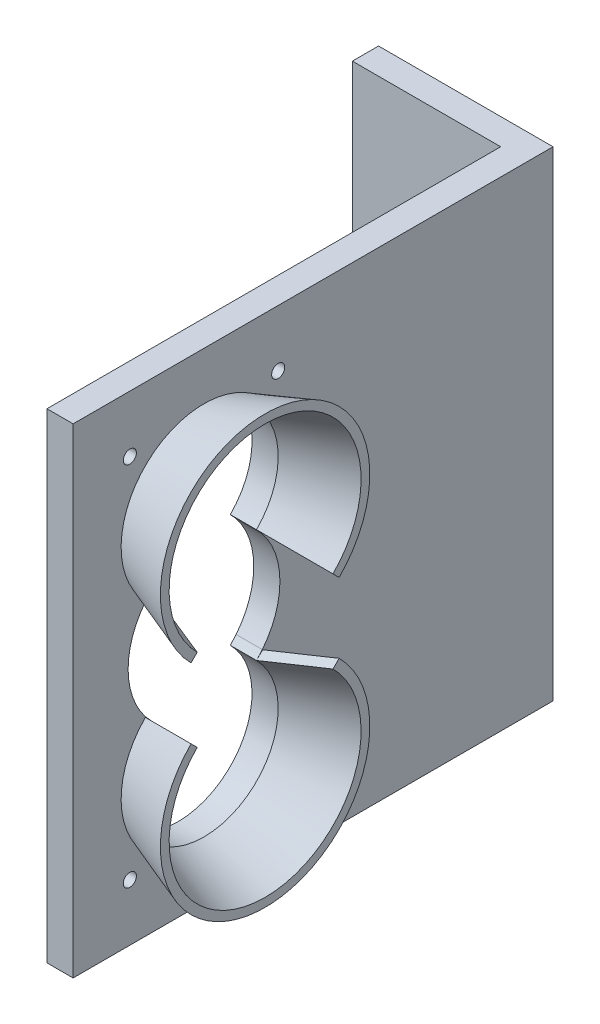
ISO-10303-21;
HEADER;
FILE_DESCRIPTION(('STEP AP214'),'2;1');
FILE_NAME('part.step','',(''),(''),'','','');
FILE_SCHEMA(('AUTOMOTIVE_DESIGN { 1 0 10303 214 1 1 1 1 }'));
ENDSEC;
DATA;
#1=APPLICATION_CONTEXT('core data for automotive mechanical design processes');
#2=APPLICATION_PROTOCOL_DEFINITION('international standard','automotive_design',2000,#1);
#3=PRODUCT_CONTEXT('',#1,'mechanical');
#4=PRODUCT('Part','Part','',(#3));
#5=PRODUCT_RELATED_PRODUCT_CATEGORY('part','',(#4));
#6=PRODUCT_DEFINITION_FORMATION('','',#4);
#7=PRODUCT_DEFINITION_CONTEXT('part definition',#1,'design');
#8=PRODUCT_DEFINITION('design','',#6,#7);
#9=PRODUCT_DEFINITION_SHAPE('','',#8);
#10=(LENGTH_UNIT() NAMED_UNIT(*) SI_UNIT(.MILLI.,.METRE.));
#11=(NAMED_UNIT(*) PLANE_ANGLE_UNIT() SI_UNIT($,.RADIAN.));
#12=(NAMED_UNIT(*) SI_UNIT($,.STERADIAN.) SOLID_ANGLE_UNIT());
#13=UNCERTAINTY_MEASURE_WITH_UNIT(LENGTH_MEASURE(1.E-05),#10,'distance_accuracy_value','');
#14=(GEOMETRIC_REPRESENTATION_CONTEXT(3) GLOBAL_UNCERTAINTY_ASSIGNED_CONTEXT((#13)) GLOBAL_UNIT_ASSIGNED_CONTEXT((#10,
#11,#12)) REPRESENTATION_CONTEXT('',''));
#15=CARTESIAN_POINT('',(0.,0.,0.));
#16=DIRECTION('',(0.,0.,1.));
#17=DIRECTION('',(1.,0.,0.));
#18=AXIS2_PLACEMENT_3D('',#15,#16,#17);
#19=CARTESIAN_POINT('',(25.8823529411765,27.5,-27.2843137254902));
#20=DIRECTION('',(-1.,0.,0.));
#21=DIRECTION('',(0.,0.,1.));
#22=AXIS2_PLACEMENT_3D('',#19,#20,#21);
#23=PLANE('',#22);
#24=CARTESIAN_POINT('',(25.8823529411765,21.,21.2156862745098));
#25=DIRECTION('',(1.,0.,0.));
#26=DIRECTION('',(0.,0.,-1.));
#27=AXIS2_PLACEMENT_3D('',#24,#25,#26);
#28=CIRCLE('',#27,0.750000000000002);
#29=CARTESIAN_POINT('',(25.8823529411765,21.,20.4656862745098));
#30=VERTEX_POINT('',#29);
#31=EDGE_CURVE('E343',#30,#30,#28,.T.);
#32=ORIENTED_EDGE('',*,*,#31,.F.);
#33=EDGE_LOOP('',(#32));
#34=FACE_BOUND('',#33,.T.);
#35=CARTESIAN_POINT('',(25.8823529411765,21.,4.2156862745098));
#36=DIRECTION('',(1.,0.,0.));
#37=DIRECTION('',(0.,0.,-1.));
#38=AXIS2_PLACEMENT_3D('',#35,#36,#37);
#39=CIRCLE('',#38,0.75);
#40=CARTESIAN_POINT('',(25.8823529411765,21.,3.4656862745098));
#41=VERTEX_POINT('',#40);
#42=EDGE_CURVE('E344',#41,#41,#39,.F.);
#43=ORIENTED_EDGE('',*,*,#42,.T.);
#44=EDGE_LOOP('',(#43));
#45=FACE_BOUND('',#44,.T.);
#46=CARTESIAN_POINT('',(25.8823529411765,-21.,21.2156862745098));
#47=DIRECTION('',(1.,0.,0.));
#48=DIRECTION('',(0.,0.,-1.));
#49=AXIS2_PLACEMENT_3D('',#46,#47,#48);
#50=CIRCLE('',#49,0.750000000000002);
#51=CARTESIAN_POINT('',(25.8823529411765,-21.,20.4656862745098));
#52=VERTEX_POINT('',#51);
#53=EDGE_CURVE('E350',#52,#52,#50,.F.);
#54=ORIENTED_EDGE('',*,*,#53,.T.);
#55=EDGE_LOOP('',(#54));
#56=FACE_BOUND('',#55,.T.);
#57=DIRECTION('',(0.,0.,-1.));
#58=VECTOR('',#57,1.);
#59=CARTESIAN_POINT('',(25.8823529411765,-27.5,-27.2843137254902));
#60=LINE('',#59,#58);
#61=CARTESIAN_POINT('',(25.8823529411765,-27.5,27.7156862745098));
#62=VERTEX_POINT('',#61);
#63=CARTESIAN_POINT('',(25.8823529411765,-27.5,-27.2843137254902));
#64=VERTEX_POINT('',#63);
#65=EDGE_CURVE('E400',#62,#64,#60,.T.);
#66=ORIENTED_EDGE('',*,*,#65,.T.);
#67=DIRECTION('',(0.,-1.,0.));
#68=VECTOR('',#67,1.);
#69=CARTESIAN_POINT('',(25.8823529411765,27.5,-27.2843137254902));
#70=LINE('',#69,#68);
#71=CARTESIAN_POINT('',(25.8823529411765,27.5,-27.2843137254902));
#72=VERTEX_POINT('',#71);
#73=EDGE_CURVE('E405',#72,#64,#70,.T.);
#74=ORIENTED_EDGE('',*,*,#73,.F.);
#75=DIRECTION('',(0.,0.,-1.));
#76=VECTOR('',#75,1.);
#77=CARTESIAN_POINT('',(25.8823529411765,27.5,-27.2843137254902));
#78=LINE('',#77,#76);
#79=CARTESIAN_POINT('',(25.8823529411765,27.5,27.7156862745098));
#80=VERTEX_POINT('',#79);
#81=EDGE_CURVE('E387',#80,#72,#78,.T.);
#82=ORIENTED_EDGE('',*,*,#81,.F.);
#83=DIRECTION('',(0.,-1.,0.));
#84=VECTOR('',#83,1.);
#85=CARTESIAN_POINT('',(25.8823529411765,27.5,27.7156862745098));
#86=LINE('',#85,#84);
#87=EDGE_CURVE('E408',#80,#62,#86,.T.);
#88=ORIENTED_EDGE('',*,*,#87,.T.);
#89=EDGE_LOOP('',(#66,#74,#82,#88));
#90=FACE_BOUND('',#89,.T.);
#91=CARTESIAN_POINT('',(25.8823529411765,-21.,4.2156862745098));
#92=DIRECTION('',(1.,0.,0.));
#93=DIRECTION('',(0.,0.,-1.));
#94=AXIS2_PLACEMENT_3D('',#91,#92,#93);
#95=CIRCLE('',#94,0.75);
#96=CARTESIAN_POINT('',(25.8823529411765,-21.,3.4656862745098));
#97=VERTEX_POINT('',#96);
#98=EDGE_CURVE('E351',#97,#97,#95,.T.);
#99=ORIENTED_EDGE('',*,*,#98,.F.);
#100=EDGE_LOOP('',(#99));
#101=FACE_BOUND('',#100,.T.);
#102=DIRECTION('',(0.,0.707106781186551,-0.707106781186544));
#103=VECTOR('',#102,1.);
#104=CARTESIAN_POINT('',(25.8823529411765,-21.3388347648319,21.5545210393416));
#105=LINE('',#104,#103);
#106=CARTESIAN_POINT('',(25.8823529411765,-6.48959235991435,6.70527863442414));
#107=VERTEX_POINT('',#106);
#108=CARTESIAN_POINT('',(25.8823529411765,-5.78248557872775,5.99817185323764));
#109=VERTEX_POINT('',#108);
#110=EDGE_CURVE('E773',#107,#109,#105,.T.);
#111=ORIENTED_EDGE('',*,*,#110,.T.);
#112=CARTESIAN_POINT('',(25.8823529411765,-12.5,12.7156862745098));
#113=DIRECTION('',(-1.,0.,0.));
#114=DIRECTION('',(0.,-1.,0.));
#115=AXIS2_PLACEMENT_3D('',#112,#113,#114);
#116=CIRCLE('',#115,9.5);
#117=CARTESIAN_POINT('',(25.8823529411765,-5.78248557872775,19.433200695782));
#118=VERTEX_POINT('',#117);
#119=EDGE_CURVE('E317',#109,#118,#116,.T.);
#120=ORIENTED_EDGE('',*,*,#119,.T.);
#121=DIRECTION('',(0.,0.707106781186551,0.707106781186544));
#122=VECTOR('',#121,1.);
#123=CARTESIAN_POINT('',(25.8823529411765,-21.3388347648319,3.87685150967802));
#124=LINE('',#123,#122);
#125=CARTESIAN_POINT('',(25.8823529411765,-6.4895923599143,18.7260939145954));
#126=VERTEX_POINT('',#125);
#127=EDGE_CURVE('E295',#126,#118,#124,.T.);
#128=ORIENTED_EDGE('',*,*,#127,.F.);
#129=DIRECTION('',(0.,-0.744628434388798,-0.667479209189086));
#130=VECTOR('',#129,1.);
#131=CARTESIAN_POINT('',(25.8823529411765,-12.1986163895243,13.6085686247462));
#132=LINE('',#131,#130);
#133=CARTESIAN_POINT('',(25.8823529411765,-5.74397055779098,19.3944635709919));
#134=VERTEX_POINT('',#133);
#135=EDGE_CURVE('E309',#134,#126,#132,.T.);
#136=ORIENTED_EDGE('',*,*,#135,.F.);
#137=CARTESIAN_POINT('',(25.8823529411765,1.196959198424E-13,12.236501554681));
#138=DIRECTION('',(1.,0.,0.));
#139=DIRECTION('',(0.,0.,-1.));
#140=AXIS2_PLACEMENT_3D('',#137,#138,#139);
#141=CIRCLE('',#140,9.17766952966388);
#142=CARTESIAN_POINT('',(25.8823529411765,5.74397055779107,19.394463570992));
#143=VERTEX_POINT('',#142);
#144=EDGE_CURVE('E820',#143,#134,#141,.T.);
#145=ORIENTED_EDGE('',*,*,#144,.F.);
#146=DIRECTION('',(0.,-0.744628434388801,0.667479209189083));
#147=VECTOR('',#146,1.);
#148=CARTESIAN_POINT('',(25.8823529411765,12.1986163895244,13.6085686247464));
#149=LINE('',#148,#147);
#150=CARTESIAN_POINT('',(25.8823529411765,6.4895923599143,18.7260939145954));
#151=VERTEX_POINT('',#150);
#152=EDGE_CURVE('E843',#151,#143,#149,.T.);
#153=ORIENTED_EDGE('',*,*,#152,.F.);
#154=DIRECTION('',(0.,-0.707106781186551,0.707106781186544));
#155=VECTOR('',#154,1.);
#156=CARTESIAN_POINT('',(25.8823529411765,21.3388347648319,3.87685150967802));
#157=LINE('',#156,#155);
#158=CARTESIAN_POINT('',(25.8823529411765,5.78248557872775,19.433200695782));
#159=VERTEX_POINT('',#158);
#160=EDGE_CURVE('E792',#151,#159,#157,.T.);
#161=ORIENTED_EDGE('',*,*,#160,.T.);
#162=CARTESIAN_POINT('',(25.8823529411765,12.5,12.7156862745098));
#163=DIRECTION('',(1.,0.,0.));
#164=DIRECTION('',(0.,1.,0.));
#165=AXIS2_PLACEMENT_3D('',#162,#163,#164);
#166=CIRCLE('',#165,9.5);
#167=CARTESIAN_POINT('',(25.8823529411765,5.78248557872775,5.99817185323764));
#168=VERTEX_POINT('',#167);
#169=EDGE_CURVE('E325',#168,#159,#166,.T.);
#170=ORIENTED_EDGE('',*,*,#169,.F.);
#171=DIRECTION('',(0.,-0.707106781186551,-0.707106781186544));
#172=VECTOR('',#171,1.);
#173=CARTESIAN_POINT('',(25.8823529411765,21.3388347648319,21.5545210393416));
#174=LINE('',#173,#172);
#175=CARTESIAN_POINT('',(25.8823529411765,6.48959235991431,6.70527863442419));
#176=VERTEX_POINT('',#175);
#177=EDGE_CURVE('E801',#176,#168,#174,.T.);
#178=ORIENTED_EDGE('',*,*,#177,.F.);
#179=DIRECTION('',(0.,-0.744628434388791,-0.667479209189094));
#180=VECTOR('',#179,1.);
#181=CARTESIAN_POINT('',(25.8823529411765,-0.441386082782293,0.492402794361899));
#182=LINE('',#181,#180);
#183=CARTESIAN_POINT('',(25.8823529411765,5.74397055779076,6.03690897802793));
#184=VERTEX_POINT('',#183);
#185=EDGE_CURVE('E837',#176,#184,#182,.T.);
#186=ORIENTED_EDGE('',*,*,#185,.T.);
#187=CARTESIAN_POINT('',(25.8823529411765,0.,13.1948709943384));
#188=DIRECTION('',(1.,0.,0.));
#189=DIRECTION('',(0.,0.,-1.));
#190=AXIS2_PLACEMENT_3D('',#187,#188,#189);
#191=CIRCLE('',#190,9.17766952966348);
#192=CARTESIAN_POINT('',(25.8823529411765,-5.74397055779096,6.03690897802773));
#193=VERTEX_POINT('',#192);
#194=EDGE_CURVE('E834',#184,#193,#191,.F.);
#195=ORIENTED_EDGE('',*,*,#194,.T.);
#196=DIRECTION('',(0.,-0.744628434388816,0.667479209189066));
#197=VECTOR('',#196,1.);
#198=CARTESIAN_POINT('',(25.8823529411765,0.441386082782288,0.49240279436193));
#199=LINE('',#198,#197);
#200=EDGE_CURVE('E308',#193,#107,#199,.T.);
#201=ORIENTED_EDGE('',*,*,#200,.T.);
#202=EDGE_LOOP('',(#111,#120,#128,#136,#145,#153,#161,#170,#178,#186,#195,#201));
#203=FACE_BOUND('',#202,.T.);
#204=ADVANCED_FACE('F149',(#34,#45,#56,#90,#101,#203),#23,.F.);
#205=CARTESIAN_POINT('',(22.8823529411765,27.5,27.7156862745098));
#206=DIRECTION('',(1.,0.,0.));
#207=DIRECTION('',(0.,0.,-1.));
#208=AXIS2_PLACEMENT_3D('',#205,#206,#207);
#209=PLANE('',#208);
#210=CARTESIAN_POINT('',(22.8823529411765,21.,21.2156862745098));
#211=DIRECTION('',(1.,0.,0.));
#212=DIRECTION('',(0.,0.,-1.));
#213=AXIS2_PLACEMENT_3D('',#210,#211,#212);
#214=CIRCLE('',#213,0.750000000000002);
#215=CARTESIAN_POINT('',(22.8823529411765,21.,20.4656862745098));
#216=VERTEX_POINT('',#215);
#217=EDGE_CURVE('E354',#216,#216,#214,.T.);
#218=ORIENTED_EDGE('',*,*,#217,.T.);
#219=EDGE_LOOP('',(#218));
#220=FACE_BOUND('',#219,.T.);
#221=CARTESIAN_POINT('',(22.8823529411765,21.,4.2156862745098));
#222=DIRECTION('',(1.,0.,0.));
#223=DIRECTION('',(0.,0.,-1.));
#224=AXIS2_PLACEMENT_3D('',#221,#222,#223);
#225=CIRCLE('',#224,0.75);
#226=CARTESIAN_POINT('',(22.8823529411765,21.,3.4656862745098));
#227=VERTEX_POINT('',#226);
#228=EDGE_CURVE('E340',#227,#227,#225,.F.);
#229=ORIENTED_EDGE('',*,*,#228,.F.);
#230=EDGE_LOOP('',(#229));
#231=FACE_BOUND('',#230,.T.);
#232=CARTESIAN_POINT('',(22.8823529411765,-21.,21.2156862745098));
#233=DIRECTION('',(1.,0.,0.));
#234=DIRECTION('',(0.,0.,-1.));
#235=AXIS2_PLACEMENT_3D('',#232,#233,#234);
#236=CIRCLE('',#235,0.750000000000002);
#237=CARTESIAN_POINT('',(22.8823529411765,-21.,20.4656862745098));
#238=VERTEX_POINT('',#237);
#239=EDGE_CURVE('E359',#238,#238,#236,.F.);
#240=ORIENTED_EDGE('',*,*,#239,.F.);
#241=EDGE_LOOP('',(#240));
#242=FACE_BOUND('',#241,.T.);
#243=DIRECTION('',(0.,0.,1.));
#244=VECTOR('',#243,1.);
#245=CARTESIAN_POINT('',(22.8823529411765,-27.5,27.7156862745098));
#246=LINE('',#245,#244);
#247=CARTESIAN_POINT('',(22.8823529411765,-27.5,-24.2843137254902));
#248=VERTEX_POINT('',#247);
#249=CARTESIAN_POINT('',(22.8823529411765,-27.5,27.7156862745098));
#250=VERTEX_POINT('',#249);
#251=EDGE_CURVE('E396',#248,#250,#246,.T.);
#252=ORIENTED_EDGE('',*,*,#251,.T.);
#253=DIRECTION('',(0.,-1.,0.));
#254=VECTOR('',#253,1.);
#255=CARTESIAN_POINT('',(22.8823529411765,27.5,27.7156862745098));
#256=LINE('',#255,#254);
#257=CARTESIAN_POINT('',(22.8823529411765,27.5,27.7156862745098));
#258=VERTEX_POINT('',#257);
#259=EDGE_CURVE('E411',#258,#250,#256,.T.);
#260=ORIENTED_EDGE('',*,*,#259,.F.);
#261=DIRECTION('',(0.,0.,1.));
#262=VECTOR('',#261,1.);
#263=CARTESIAN_POINT('',(22.8823529411765,27.5,27.7156862745098));
#264=LINE('',#263,#262);
#265=CARTESIAN_POINT('',(22.8823529411765,27.5,-24.2843137254902));
#266=VERTEX_POINT('',#265);
#267=EDGE_CURVE('E383',#266,#258,#264,.T.);
#268=ORIENTED_EDGE('',*,*,#267,.F.);
#269=DIRECTION('',(0.,-1.,0.));
#270=VECTOR('',#269,1.);
#271=CARTESIAN_POINT('',(22.8823529411765,27.5,-24.2843137254902));
#272=LINE('',#271,#270);
#273=EDGE_CURVE('E157',#266,#248,#272,.T.);
#274=ORIENTED_EDGE('',*,*,#273,.T.);
#275=EDGE_LOOP('',(#252,#260,#268,#274));
#276=FACE_BOUND('',#275,.T.);
#277=CARTESIAN_POINT('',(22.8823529411765,1.196959198424E-13,12.236501554681));
#278=DIRECTION('',(1.,0.,0.));
#279=DIRECTION('',(0.,0.,-1.));
#280=AXIS2_PLACEMENT_3D('',#277,#278,#279);
#281=CIRCLE('',#280,9.17766952966388);
#282=CARTESIAN_POINT('',(22.8823529411765,5.74397055779107,19.394463570992));
#283=VERTEX_POINT('',#282);
#284=CARTESIAN_POINT('',(22.8823529411765,-5.74397055779098,19.3944635709919));
#285=VERTEX_POINT('',#284);
#286=EDGE_CURVE('E331',#283,#285,#281,.T.);
#287=ORIENTED_EDGE('',*,*,#286,.T.);
#288=DIRECTION('',(0.,-0.744628434388798,-0.667479209189086));
#289=VECTOR('',#288,1.);
#290=CARTESIAN_POINT('',(22.8823529411765,-12.1986163895243,13.6085686247462));
#291=LINE('',#290,#289);
#292=CARTESIAN_POINT('',(22.8823529411765,-6.48959235991436,18.7260939145955));
#293=VERTEX_POINT('',#292);
#294=EDGE_CURVE('E818',#285,#293,#291,.T.);
#295=ORIENTED_EDGE('',*,*,#294,.T.);
#296=CARTESIAN_POINT('',(22.8823529411765,-12.5,12.7156862745098));
#297=DIRECTION('',(1.,0.,0.));
#298=DIRECTION('',(0.,0.,-1.));
#299=AXIS2_PLACEMENT_3D('',#296,#297,#298);
#300=CIRCLE('',#299,8.5);
#301=CARTESIAN_POINT('',(22.8823529411765,-6.48959235991435,6.70527863442414));
#302=VERTEX_POINT('',#301);
#303=EDGE_CURVE('E329',#293,#302,#300,.T.);
#304=ORIENTED_EDGE('',*,*,#303,.T.);
#305=DIRECTION('',(0.,-0.744628434388816,0.667479209189066));
#306=VECTOR('',#305,1.);
#307=CARTESIAN_POINT('',(22.8823529411765,0.441386082782288,0.49240279436193));
#308=LINE('',#307,#306);
#309=CARTESIAN_POINT('',(22.8823529411765,-5.74397055779096,6.03690897802773));
#310=VERTEX_POINT('',#309);
#311=EDGE_CURVE('E822',#310,#302,#308,.T.);
#312=ORIENTED_EDGE('',*,*,#311,.F.);
#313=CARTESIAN_POINT('',(22.8823529411765,0.,13.1948709943384));
#314=DIRECTION('',(1.,0.,0.));
#315=DIRECTION('',(0.,0.,-1.));
#316=AXIS2_PLACEMENT_3D('',#313,#314,#315);
#317=CIRCLE('',#316,9.17766952966348);
#318=CARTESIAN_POINT('',(22.8823529411765,5.74397055779076,6.03690897802793));
#319=VERTEX_POINT('',#318);
#320=EDGE_CURVE('E824',#319,#310,#317,.F.);
#321=ORIENTED_EDGE('',*,*,#320,.F.);
#322=DIRECTION('',(0.,-0.744628434388791,-0.667479209189094));
#323=VECTOR('',#322,1.);
#324=CARTESIAN_POINT('',(22.8823529411765,-0.441386082782293,0.492402794361899));
#325=LINE('',#324,#323);
#326=CARTESIAN_POINT('',(22.8823529411765,6.48959235991413,6.70527863442437));
#327=VERTEX_POINT('',#326);
#328=EDGE_CURVE('E826',#327,#319,#325,.T.);
#329=ORIENTED_EDGE('',*,*,#328,.F.);
#330=CARTESIAN_POINT('',(22.8823529411765,12.5,12.7156862745098));
#331=DIRECTION('',(1.,0.,0.));
#332=DIRECTION('',(0.,0.,-1.));
#333=AXIS2_PLACEMENT_3D('',#330,#331,#332);
#334=CIRCLE('',#333,8.5);
#335=CARTESIAN_POINT('',(22.8823529411765,6.48959235991446,18.7260939145956));
#336=VERTEX_POINT('',#335);
#337=EDGE_CURVE('E828',#327,#336,#334,.T.);
#338=ORIENTED_EDGE('',*,*,#337,.T.);
#339=DIRECTION('',(0.,-0.744628434388801,0.667479209189083));
#340=VECTOR('',#339,1.);
#341=CARTESIAN_POINT('',(22.8823529411765,12.1986163895244,13.6085686247464));
#342=LINE('',#341,#340);
#343=EDGE_CURVE('E336',#336,#283,#342,.T.);
#344=ORIENTED_EDGE('',*,*,#343,.T.);
#345=EDGE_LOOP('',(#287,#295,#304,#312,#321,#329,#338,#344));
#346=FACE_BOUND('',#345,.T.);
#347=CARTESIAN_POINT('',(22.8823529411765,-21.,4.2156862745098));
#348=DIRECTION('',(1.,0.,0.));
#349=DIRECTION('',(0.,0.,-1.));
#350=AXIS2_PLACEMENT_3D('',#347,#348,#349);
#351=CIRCLE('',#350,0.75);
#352=CARTESIAN_POINT('',(22.8823529411765,-21.,3.4656862745098));
#353=VERTEX_POINT('',#352);
#354=EDGE_CURVE('E347',#353,#353,#351,.T.);
#355=ORIENTED_EDGE('',*,*,#354,.T.);
#356=EDGE_LOOP('',(#355));
#357=FACE_BOUND('',#356,.T.);
#358=ADVANCED_FACE('F418',(#220,#231,#242,#276,#346,#357),#209,.F.);
#359=CARTESIAN_POINT('',(22.8823529411765,27.5,-24.2843137254902));
#360=DIRECTION('',(0.,0.,-1.));
#361=DIRECTION('',(-1.,0.,0.));
#362=AXIS2_PLACEMENT_3D('',#359,#360,#361);
#363=PLANE('',#362);
#364=CARTESIAN_POINT('',(13.3823529411765,-10.,-24.2843137254902));
#365=DIRECTION('',(0.,0.,-1.));
#366=DIRECTION('',(-1.,0.,0.));
#367=AXIS2_PLACEMENT_3D('',#364,#365,#366);
#368=CIRCLE('',#367,1.5);
#369=CARTESIAN_POINT('',(11.8823529411765,-10.,-24.2843137254902));
#370=VERTEX_POINT('',#369);
#371=EDGE_CURVE('E372',#370,#370,#368,.T.);
#372=ORIENTED_EDGE('',*,*,#371,.T.);
#373=EDGE_LOOP('',(#372));
#374=FACE_BOUND('',#373,.T.);
#375=DIRECTION('',(1.,0.,0.));
#376=VECTOR('',#375,1.);
#377=CARTESIAN_POINT('',(22.8823529411765,-27.5,-24.2843137254902));
#378=LINE('',#377,#376);
#379=CARTESIAN_POINT('',(5.88235294117648,-27.5,-24.2843137254902));
#380=VERTEX_POINT('',#379);
#381=EDGE_CURVE('E394',#380,#248,#378,.T.);
#382=ORIENTED_EDGE('',*,*,#381,.T.);
#383=ORIENTED_EDGE('',*,*,#273,.F.);
#384=DIRECTION('',(1.,0.,0.));
#385=VECTOR('',#384,1.);
#386=CARTESIAN_POINT('',(22.8823529411765,27.5,-24.2843137254902));
#387=LINE('',#386,#385);
#388=CARTESIAN_POINT('',(5.88235294117648,27.5,-24.2843137254902));
#389=VERTEX_POINT('',#388);
#390=EDGE_CURVE('E380',#389,#266,#387,.T.);
#391=ORIENTED_EDGE('',*,*,#390,.F.);
#392=DIRECTION('',(0.,-1.,0.));
#393=VECTOR('',#392,1.);
#394=CARTESIAN_POINT('',(5.88235294117648,27.5,-24.2843137254902));
#395=LINE('',#394,#393);
#396=EDGE_CURVE('E12',#389,#380,#395,.T.);
#397=ORIENTED_EDGE('',*,*,#396,.T.);
#398=EDGE_LOOP('',(#382,#383,#391,#397));
#399=FACE_BOUND('',#398,.T.);
#400=CARTESIAN_POINT('',(13.3823529411765,10.,-24.2843137254902));
#401=DIRECTION('',(0.,0.,-1.));
#402=DIRECTION('',(-1.,0.,0.));
#403=AXIS2_PLACEMENT_3D('',#400,#401,#402);
#404=CIRCLE('',#403,1.5);
#405=CARTESIAN_POINT('',(11.8823529411765,10.,-24.2843137254902));
#406=VERTEX_POINT('',#405);
#407=EDGE_CURVE('E365',#406,#406,#404,.F.);
#408=ORIENTED_EDGE('',*,*,#407,.F.);
#409=EDGE_LOOP('',(#408));
#410=FACE_BOUND('',#409,.T.);
#411=ADVANCED_FACE('F442',(#374,#399,#410),#363,.F.);
#412=CARTESIAN_POINT('',(5.88235294117648,27.5,-27.2843137254902));
#413=DIRECTION('',(0.,0.,1.));
#414=DIRECTION('',(1.,0.,0.));
#415=AXIS2_PLACEMENT_3D('',#412,#413,#414);
#416=PLANE('',#415);
#417=CARTESIAN_POINT('',(13.3823529411765,-10.,-27.2843137254902));
#418=DIRECTION('',(0.,0.,-1.));
#419=DIRECTION('',(-1.,0.,0.));
#420=AXIS2_PLACEMENT_3D('',#417,#418,#419);
#421=CIRCLE('',#420,1.5);
#422=CARTESIAN_POINT('',(11.8823529411765,-10.,-27.2843137254902));
#423=VERTEX_POINT('',#422);
#424=EDGE_CURVE('E362',#423,#423,#421,.T.);
#425=ORIENTED_EDGE('',*,*,#424,.F.);
#426=EDGE_LOOP('',(#425));
#427=FACE_BOUND('',#426,.T.);
#428=DIRECTION('',(-1.,0.,0.));
#429=VECTOR('',#428,1.);
#430=CARTESIAN_POINT('',(5.88235294117648,-27.5,-27.2843137254902));
#431=LINE('',#430,#429);
#432=CARTESIAN_POINT('',(5.88235294117648,-27.5,-27.2843137254902));
#433=VERTEX_POINT('',#432);
#434=EDGE_CURVE('E381',#64,#433,#431,.T.);
#435=ORIENTED_EDGE('',*,*,#434,.T.);
#436=DIRECTION('',(0.,-1.,0.));
#437=VECTOR('',#436,1.);
#438=CARTESIAN_POINT('',(5.88235294117648,27.5,-27.2843137254902));
#439=LINE('',#438,#437);
#440=CARTESIAN_POINT('',(5.88235294117648,27.5,-27.2843137254902));
#441=VERTEX_POINT('',#440);
#442=EDGE_CURVE('E391',#441,#433,#439,.T.);
#443=ORIENTED_EDGE('',*,*,#442,.F.);
#444=DIRECTION('',(-1.,0.,0.));
#445=VECTOR('',#444,1.);
#446=CARTESIAN_POINT('',(5.88235294117648,27.5,-27.2843137254902));
#447=LINE('',#446,#445);
#448=EDGE_CURVE('E389',#72,#441,#447,.T.);
#449=ORIENTED_EDGE('',*,*,#448,.F.);
#450=ORIENTED_EDGE('',*,*,#73,.T.);
#451=EDGE_LOOP('',(#435,#443,#449,#450));
#452=FACE_BOUND('',#451,.T.);
#453=CARTESIAN_POINT('',(13.3823529411765,10.,-27.2843137254902));
#454=DIRECTION('',(0.,0.,-1.));
#455=DIRECTION('',(-1.,0.,0.));
#456=AXIS2_PLACEMENT_3D('',#453,#454,#455);
#457=CIRCLE('',#456,1.5);
#458=CARTESIAN_POINT('',(11.8823529411765,10.,-27.2843137254902));
#459=VERTEX_POINT('',#458);
#460=EDGE_CURVE('E369',#459,#459,#457,.F.);
#461=ORIENTED_EDGE('',*,*,#460,.T.);
#462=EDGE_LOOP('',(#461));
#463=FACE_BOUND('',#462,.T.);
#464=ADVANCED_FACE('F446',(#427,#452,#463),#416,.F.);
#465=CARTESIAN_POINT('',(5.88235294117648,27.5,-24.2843137254902));
#466=DIRECTION('',(1.,0.,0.));
#467=DIRECTION('',(0.,0.,-1.));
#468=AXIS2_PLACEMENT_3D('',#465,#466,#467);
#469=PLANE('',#468);
#470=DIRECTION('',(0.,0.,1.));
#471=VECTOR('',#470,1.);
#472=CARTESIAN_POINT('',(5.88235294117648,-27.5,-24.2843137254902));
#473=LINE('',#472,#471);
#474=EDGE_CURVE('E368',#433,#380,#473,.T.);
#475=ORIENTED_EDGE('',*,*,#474,.T.);
#476=ORIENTED_EDGE('',*,*,#396,.F.);
#477=DIRECTION('',(0.,0.,1.));
#478=VECTOR('',#477,1.);
#479=CARTESIAN_POINT('',(5.88235294117648,27.5,-24.2843137254902));
#480=LINE('',#479,#478);
#481=EDGE_CURVE('E377',#441,#389,#480,.T.);
#482=ORIENTED_EDGE('',*,*,#481,.F.);
#483=ORIENTED_EDGE('',*,*,#442,.T.);
#484=EDGE_LOOP('',(#475,#476,#482,#483));
#485=FACE_BOUND('',#484,.T.);
#486=ADVANCED_FACE('F151',(#485),#469,.F.);
#487=CARTESIAN_POINT('',(25.8823529411765,27.5,27.7156862745098));
#488=DIRECTION('',(0.,0.,-1.));
#489=DIRECTION('',(-1.,0.,0.));
#490=AXIS2_PLACEMENT_3D('',#487,#488,#489);
#491=PLANE('',#490);
#492=DIRECTION('',(1.,0.,0.));
#493=VECTOR('',#492,1.);
#494=CARTESIAN_POINT('',(25.8823529411765,-27.5,27.7156862745098));
#495=LINE('',#494,#493);
#496=EDGE_CURVE('E398',#250,#62,#495,.T.);
#497=ORIENTED_EDGE('',*,*,#496,.T.);
#498=ORIENTED_EDGE('',*,*,#87,.F.);
#499=DIRECTION('',(1.,0.,0.));
#500=VECTOR('',#499,1.);
#501=CARTESIAN_POINT('',(25.8823529411765,27.5,27.7156862745098));
#502=LINE('',#501,#500);
#503=EDGE_CURVE('E385',#258,#80,#502,.T.);
#504=ORIENTED_EDGE('',*,*,#503,.F.);
#505=ORIENTED_EDGE('',*,*,#259,.T.);
#506=EDGE_LOOP('',(#497,#498,#504,#505));
#507=FACE_BOUND('',#506,.T.);
#508=ADVANCED_FACE('F430',(#507),#491,.F.);
#509=CARTESIAN_POINT('',(0.,27.5,0.));
#510=DIRECTION('',(0.,-1.,0.));
#511=DIRECTION('',(0.,0.,-1.));
#512=AXIS2_PLACEMENT_3D('',#509,#510,#511);
#513=PLANE('',#512);
#514=ORIENTED_EDGE('',*,*,#481,.T.);
#515=ORIENTED_EDGE('',*,*,#390,.T.);
#516=ORIENTED_EDGE('',*,*,#267,.T.);
#517=ORIENTED_EDGE('',*,*,#503,.T.);
#518=ORIENTED_EDGE('',*,*,#81,.T.);
#519=ORIENTED_EDGE('',*,*,#448,.T.);
#520=EDGE_LOOP('',(#514,#515,#516,#517,#518,#519));
#521=FACE_BOUND('',#520,.T.);
#522=ADVANCED_FACE('F438',(#521),#513,.F.);
#523=CARTESIAN_POINT('',(0.,-27.5,0.));
#524=DIRECTION('',(0.,-1.,0.));
#525=DIRECTION('',(0.,0.,-1.));
#526=AXIS2_PLACEMENT_3D('',#523,#524,#525);
#527=PLANE('',#526);
#528=ORIENTED_EDGE('',*,*,#474,.F.);
#529=ORIENTED_EDGE('',*,*,#434,.F.);
#530=ORIENTED_EDGE('',*,*,#65,.F.);
#531=ORIENTED_EDGE('',*,*,#496,.F.);
#532=ORIENTED_EDGE('',*,*,#251,.F.);
#533=ORIENTED_EDGE('',*,*,#381,.F.);
#534=EDGE_LOOP('',(#528,#529,#530,#531,#532,#533));
#535=FACE_BOUND('',#534,.T.);
#536=ADVANCED_FACE('F425',(#535),#527,.T.);
#537=CARTESIAN_POINT('',(13.3823529411765,-10.,-24.2843137254902));
#538=DIRECTION('',(0.,0.,-1.));
#539=DIRECTION('',(-1.,0.,0.));
#540=AXIS2_PLACEMENT_3D('',#537,#538,#539);
#541=CYLINDRICAL_SURFACE('',#540,1.5);
#542=ORIENTED_EDGE('',*,*,#371,.F.);
#543=EDGE_LOOP('',(#542));
#544=FACE_BOUND('',#543,.T.);
#545=ORIENTED_EDGE('',*,*,#424,.T.);
#546=EDGE_LOOP('',(#545));
#547=FACE_BOUND('',#546,.T.);
#548=ADVANCED_FACE('F456',(#544,#547),#541,.F.);
#549=CARTESIAN_POINT('',(13.3823529411765,10.,-24.2843137254902));
#550=DIRECTION('',(0.,0.,-1.));
#551=DIRECTION('',(-1.,0.,0.));
#552=AXIS2_PLACEMENT_3D('',#549,#550,#551);
#553=CYLINDRICAL_SURFACE('',#552,1.5);
#554=ORIENTED_EDGE('',*,*,#407,.T.);
#555=EDGE_LOOP('',(#554));
#556=FACE_BOUND('',#555,.T.);
#557=ORIENTED_EDGE('',*,*,#460,.F.);
#558=EDGE_LOOP('',(#557));
#559=FACE_BOUND('',#558,.T.);
#560=ADVANCED_FACE('F453',(#556,#559),#553,.F.);
#561=CARTESIAN_POINT('',(22.8823529411765,-21.,21.2156862745098));
#562=DIRECTION('',(1.,0.,0.));
#563=DIRECTION('',(0.,0.,-1.));
#564=AXIS2_PLACEMENT_3D('',#561,#562,#563);
#565=CYLINDRICAL_SURFACE('',#564,0.750000000000002);
#566=ORIENTED_EDGE('',*,*,#239,.T.);
#567=EDGE_LOOP('',(#566));
#568=FACE_BOUND('',#567,.T.);
#569=ORIENTED_EDGE('',*,*,#53,.F.);
#570=EDGE_LOOP('',(#569));
#571=FACE_BOUND('',#570,.T.);
#572=ADVANCED_FACE('F455',(#568,#571),#565,.F.);
#573=CARTESIAN_POINT('',(22.8823529411765,21.,4.2156862745098));
#574=DIRECTION('',(1.,0.,0.));
#575=DIRECTION('',(0.,0.,-1.));
#576=AXIS2_PLACEMENT_3D('',#573,#574,#575);
#577=CYLINDRICAL_SURFACE('',#576,0.75);
#578=ORIENTED_EDGE('',*,*,#228,.T.);
#579=EDGE_LOOP('',(#578));
#580=FACE_BOUND('',#579,.T.);
#581=ORIENTED_EDGE('',*,*,#42,.F.);
#582=EDGE_LOOP('',(#581));
#583=FACE_BOUND('',#582,.T.);
#584=ADVANCED_FACE('F463',(#580,#583),#577,.F.);
#585=CARTESIAN_POINT('',(22.8823529411765,-12.1986163895243,13.6085686247462));
#586=DIRECTION('',(0.,-0.667479209189086,0.744628434388798));
#587=DIRECTION('',(0.,-0.744628434388798,-0.667479209189086));
#588=AXIS2_PLACEMENT_3D('',#585,#586,#587);
#589=PLANE('',#588);
#590=ORIENTED_EDGE('',*,*,#135,.T.);
#591=DIRECTION('',(1.,0.,0.));
#592=VECTOR('',#591,1.);
#593=CARTESIAN_POINT('',(22.8823529411765,-6.48959235991436,18.7260939145955));
#594=LINE('',#593,#592);
#595=EDGE_CURVE('E322',#293,#126,#594,.T.);
#596=ORIENTED_EDGE('',*,*,#595,.F.);
#597=ORIENTED_EDGE('',*,*,#294,.F.);
#598=DIRECTION('',(1.,0.,0.));
#599=VECTOR('',#598,1.);
#600=CARTESIAN_POINT('',(22.8823529411765,-5.74397055779098,19.3944635709919));
#601=LINE('',#600,#599);
#602=EDGE_CURVE('E323',#285,#134,#601,.T.);
#603=ORIENTED_EDGE('',*,*,#602,.T.);
#604=EDGE_LOOP('',(#590,#596,#597,#603));
#605=FACE_BOUND('',#604,.T.);
#606=ADVANCED_FACE('F320',(#605),#589,.F.);
#607=CARTESIAN_POINT('',(22.8823529411765,1.196959198424E-13,12.236501554681));
#608=DIRECTION('',(1.,0.,0.));
#609=DIRECTION('',(0.,0.,-1.));
#610=AXIS2_PLACEMENT_3D('',#607,#608,#609);
#611=CYLINDRICAL_SURFACE('',#610,9.17766952966388);
#612=ORIENTED_EDGE('',*,*,#144,.T.);
#613=ORIENTED_EDGE('',*,*,#602,.F.);
#614=ORIENTED_EDGE('',*,*,#286,.F.);
#615=DIRECTION('',(1.,0.,0.));
#616=VECTOR('',#615,1.);
#617=CARTESIAN_POINT('',(22.8823529411765,5.74397055779107,19.394463570992));
#618=LINE('',#617,#616);
#619=EDGE_CURVE('E848',#283,#143,#618,.T.);
#620=ORIENTED_EDGE('',*,*,#619,.T.);
#621=EDGE_LOOP('',(#612,#613,#614,#620));
#622=FACE_BOUND('',#621,.T.);
#623=ADVANCED_FACE('F553',(#622),#611,.F.);
#624=CARTESIAN_POINT('',(22.8823529411765,12.1986163895244,13.6085686247464));
#625=DIRECTION('',(0.,0.667479209189082,0.744628434388801));
#626=DIRECTION('',(0.,-0.744628434388801,0.667479209189083));
#627=AXIS2_PLACEMENT_3D('',#624,#625,#626);
#628=PLANE('',#627);
#629=ORIENTED_EDGE('',*,*,#152,.T.);
#630=ORIENTED_EDGE('',*,*,#619,.F.);
#631=ORIENTED_EDGE('',*,*,#343,.F.);
#632=DIRECTION('',(1.,0.,0.));
#633=VECTOR('',#632,1.);
#634=CARTESIAN_POINT('',(22.8823529411765,6.48959235991446,18.7260939145956));
#635=LINE('',#634,#633);
#636=EDGE_CURVE('E850',#336,#151,#635,.T.);
#637=ORIENTED_EDGE('',*,*,#636,.T.);
#638=EDGE_LOOP('',(#629,#630,#631,#637));
#639=FACE_BOUND('',#638,.T.);
#640=ADVANCED_FACE('F558',(#639),#628,.F.);
#641=CARTESIAN_POINT('',(22.8823529411765,12.5,12.7156862745098));
#642=DIRECTION('',(1.,0.,0.));
#643=DIRECTION('',(0.,0.,-1.));
#644=AXIS2_PLACEMENT_3D('',#641,#642,#643);
#645=CYLINDRICAL_SURFACE('',#644,8.5);
#646=CARTESIAN_POINT('',(25.8823529411765,12.5,12.7156862745098));
#647=DIRECTION('',(1.,0.,0.));
#648=DIRECTION('',(0.,0.,-1.));
#649=AXIS2_PLACEMENT_3D('',#646,#647,#648);
#650=CIRCLE('',#649,8.5);
#651=EDGE_CURVE('E840',#176,#151,#650,.T.);
#652=ORIENTED_EDGE('',*,*,#651,.T.);
#653=ORIENTED_EDGE('',*,*,#636,.F.);
#654=ORIENTED_EDGE('',*,*,#337,.F.);
#655=DIRECTION('',(1.,0.,0.));
#656=VECTOR('',#655,1.);
#657=CARTESIAN_POINT('',(22.8823529411765,6.48959235991413,6.70527863442437));
#658=LINE('',#657,#656);
#659=EDGE_CURVE('E853',#327,#176,#658,.T.);
#660=ORIENTED_EDGE('',*,*,#659,.T.);
#661=EDGE_LOOP('',(#652,#653,#654,#660));
#662=FACE_BOUND('',#661,.T.);
#663=ADVANCED_FACE('F613',(#662),#645,.F.);
#664=CARTESIAN_POINT('',(22.8823529411765,-0.441386082782293,0.492402794361899));
#665=DIRECTION('',(0.,-0.667479209189093,0.744628434388791));
#666=DIRECTION('',(0.,-0.744628434388791,-0.667479209189094));
#667=AXIS2_PLACEMENT_3D('',#664,#665,#666);
#668=PLANE('',#667);
#669=ORIENTED_EDGE('',*,*,#185,.F.);
#670=ORIENTED_EDGE('',*,*,#659,.F.);
#671=ORIENTED_EDGE('',*,*,#328,.T.);
#672=DIRECTION('',(1.,0.,0.));
#673=VECTOR('',#672,1.);
#674=CARTESIAN_POINT('',(22.8823529411765,5.74397055779076,6.03690897802793));
#675=LINE('',#674,#673);
#676=EDGE_CURVE('E856',#319,#184,#675,.T.);
#677=ORIENTED_EDGE('',*,*,#676,.T.);
#678=EDGE_LOOP('',(#669,#670,#671,#677));
#679=FACE_BOUND('',#678,.T.);
#680=ADVANCED_FACE('F573',(#679),#668,.T.);
#681=CARTESIAN_POINT('',(22.8823529411765,0.,13.1948709943384));
#682=DIRECTION('',(1.,0.,0.));
#683=DIRECTION('',(0.,0.,-1.));
#684=AXIS2_PLACEMENT_3D('',#681,#682,#683);
#685=CYLINDRICAL_SURFACE('',#684,9.17766952966348);
#686=ORIENTED_EDGE('',*,*,#194,.F.);
#687=ORIENTED_EDGE('',*,*,#676,.F.);
#688=ORIENTED_EDGE('',*,*,#320,.T.);
#689=DIRECTION('',(1.,0.,0.));
#690=VECTOR('',#689,1.);
#691=CARTESIAN_POINT('',(22.8823529411765,-5.74397055779096,6.03690897802773));
#692=LINE('',#691,#690);
#693=EDGE_CURVE('E333',#310,#193,#692,.T.);
#694=ORIENTED_EDGE('',*,*,#693,.T.);
#695=EDGE_LOOP('',(#686,#687,#688,#694));
#696=FACE_BOUND('',#695,.T.);
#697=ADVANCED_FACE('F567',(#696),#685,.F.);
#698=CARTESIAN_POINT('',(22.8823529411765,0.441386082782288,0.49240279436193));
#699=DIRECTION('',(0.,0.667479209189066,0.744628434388816));
#700=DIRECTION('',(0.,-0.744628434388816,0.667479209189066));
#701=AXIS2_PLACEMENT_3D('',#698,#699,#700);
#702=PLANE('',#701);
#703=ORIENTED_EDGE('',*,*,#200,.F.);
#704=ORIENTED_EDGE('',*,*,#693,.F.);
#705=ORIENTED_EDGE('',*,*,#311,.T.);
#706=DIRECTION('',(1.,0.,0.));
#707=VECTOR('',#706,1.);
#708=CARTESIAN_POINT('',(22.8823529411765,-6.48959235991435,6.70527863442414));
#709=LINE('',#708,#707);
#710=EDGE_CURVE('E172',#302,#107,#709,.T.);
#711=ORIENTED_EDGE('',*,*,#710,.T.);
#712=EDGE_LOOP('',(#703,#704,#705,#711));
#713=FACE_BOUND('',#712,.T.);
#714=ADVANCED_FACE('F572',(#713),#702,.T.);
#715=CARTESIAN_POINT('',(22.8823529411765,-12.5,12.7156862745098));
#716=DIRECTION('',(1.,0.,0.));
#717=DIRECTION('',(0.,0.,-1.));
#718=AXIS2_PLACEMENT_3D('',#715,#716,#717);
#719=CYLINDRICAL_SURFACE('',#718,8.5);
#720=CARTESIAN_POINT('',(25.8823529411765,-12.5,12.7156862745098));
#721=DIRECTION('',(1.,0.,0.));
#722=DIRECTION('',(0.,0.,-1.));
#723=AXIS2_PLACEMENT_3D('',#720,#721,#722);
#724=CIRCLE('',#723,8.5);
#725=EDGE_CURVE('E303',#126,#107,#724,.T.);
#726=ORIENTED_EDGE('',*,*,#725,.T.);
#727=ORIENTED_EDGE('',*,*,#710,.F.);
#728=ORIENTED_EDGE('',*,*,#303,.F.);
#729=ORIENTED_EDGE('',*,*,#595,.T.);
#730=EDGE_LOOP('',(#726,#727,#728,#729));
#731=FACE_BOUND('',#730,.T.);
#732=ADVANCED_FACE('F327',(#731),#719,.F.);
#733=CARTESIAN_POINT('',(22.8823529411765,21.,21.2156862745098));
#734=DIRECTION('',(1.,0.,0.));
#735=DIRECTION('',(0.,0.,-1.));
#736=AXIS2_PLACEMENT_3D('',#733,#734,#735);
#737=CYLINDRICAL_SURFACE('',#736,0.750000000000002);
#738=ORIENTED_EDGE('',*,*,#217,.F.);
#739=EDGE_LOOP('',(#738));
#740=FACE_BOUND('',#739,.T.);
#741=ORIENTED_EDGE('',*,*,#31,.T.);
#742=EDGE_LOOP('',(#741));
#743=FACE_BOUND('',#742,.T.);
#744=ADVANCED_FACE('F584',(#740,#743),#737,.F.);
#745=CARTESIAN_POINT('',(22.8823529411765,-21.,4.2156862745098));
#746=DIRECTION('',(1.,0.,0.));
#747=DIRECTION('',(0.,0.,-1.));
#748=AXIS2_PLACEMENT_3D('',#745,#746,#747);
#749=CYLINDRICAL_SURFACE('',#748,0.75);
#750=ORIENTED_EDGE('',*,*,#354,.F.);
#751=EDGE_LOOP('',(#750));
#752=FACE_BOUND('',#751,.T.);
#753=ORIENTED_EDGE('',*,*,#98,.T.);
#754=EDGE_LOOP('',(#753));
#755=FACE_BOUND('',#754,.T.);
#756=ADVANCED_FACE('F589',(#752,#755),#749,.F.);
#757=CARTESIAN_POINT('',(25.8823529411765,12.5,12.7156862745098));
#758=DIRECTION('',(1.,0.,0.));
#759=DIRECTION('',(0.,1.,0.));
#760=AXIS2_PLACEMENT_3D('',#757,#758,#759);
#761=CONICAL_SURFACE('',#760,9.5,0.343023940420704);
#762=CARTESIAN_POINT('',(32.8823529411765,12.5,12.7156862745098));
#763=DIRECTION('',(1.,0.,0.));
#764=DIRECTION('',(0.,1.,0.));
#765=AXIS2_PLACEMENT_3D('',#762,#763,#764);
#766=CIRCLE('',#765,12.);
#767=CARTESIAN_POINT('',(32.8823529411765,4.01471862576137,4.23040490027128));
#768=VERTEX_POINT('',#767);
#769=CARTESIAN_POINT('',(32.8823529411765,4.01471862576136,21.2009676487483));
#770=VERTEX_POINT('',#769);
#771=EDGE_CURVE('E815',#768,#770,#766,.T.);
#772=ORIENTED_EDGE('',*,*,#771,.F.);
#773=DIRECTION('',(0.941741911594837,-0.237825747077249,-0.237825747077246));
#774=VECTOR('',#773,1.);
#775=CARTESIAN_POINT('',(-4.0404578120841,13.3391364343679,13.5548227088777));
#776=LINE('',#775,#774);
#777=EDGE_CURVE('E810',#168,#768,#776,.T.);
#778=ORIENTED_EDGE('',*,*,#777,.F.);
#779=ORIENTED_EDGE('',*,*,#169,.T.);
#780=DIRECTION('',(0.941741911594837,-0.237825747077249,0.237825747077246));
#781=VECTOR('',#780,1.);
#782=CARTESIAN_POINT('',(-4.0404578120841,13.3391364343679,11.8765498401419));
#783=LINE('',#782,#781);
#784=EDGE_CURVE('E164',#159,#770,#783,.T.);
#785=ORIENTED_EDGE('',*,*,#784,.T.);
#786=EDGE_LOOP('',(#772,#778,#779,#785));
#787=FACE_BOUND('',#786,.T.);
#788=ADVANCED_FACE('F602',(#787),#761,.T.);
#789=CARTESIAN_POINT('',(32.8823529411765,21.3388347648319,21.5545210393416));
#790=DIRECTION('',(1.,0.,0.));
#791=DIRECTION('',(0.,1.,0.));
#792=AXIS2_PLACEMENT_3D('',#789,#790,#791);
#793=PLANE('',#792);
#794=CARTESIAN_POINT('',(32.8823529411765,12.5,12.7156862745098));
#795=DIRECTION('',(1.,0.,0.));
#796=DIRECTION('',(0.,1.,0.));
#797=AXIS2_PLACEMENT_3D('',#794,#795,#796);
#798=CIRCLE('',#797,11.);
#799=CARTESIAN_POINT('',(32.8823529411765,4.72182540694792,4.93751168145782));
#800=VERTEX_POINT('',#799);
#801=CARTESIAN_POINT('',(32.8823529411765,4.72182540694791,20.4938608675618));
#802=VERTEX_POINT('',#801);
#803=EDGE_CURVE('E813',#800,#802,#798,.T.);
#804=ORIENTED_EDGE('',*,*,#803,.F.);
#805=DIRECTION('',(0.,-0.707106781186551,-0.707106781186544));
#806=VECTOR('',#805,1.);
#807=CARTESIAN_POINT('',(32.8823529411765,21.3388347648319,21.5545210393416));
#808=LINE('',#807,#806);
#809=EDGE_CURVE('E807',#800,#768,#808,.T.);
#810=ORIENTED_EDGE('',*,*,#809,.T.);
#811=ORIENTED_EDGE('',*,*,#771,.T.);
#812=DIRECTION('',(0.,-0.707106781186551,0.707106781186544));
#813=VECTOR('',#812,1.);
#814=CARTESIAN_POINT('',(32.8823529411765,21.3388347648319,3.87685150967802));
#815=LINE('',#814,#813);
#816=EDGE_CURVE('E798',#802,#770,#815,.T.);
#817=ORIENTED_EDGE('',*,*,#816,.F.);
#818=EDGE_LOOP('',(#804,#810,#811,#817));
#819=FACE_BOUND('',#818,.T.);
#820=ADVANCED_FACE('F640',(#819),#793,.T.);
#821=CARTESIAN_POINT('',(25.8823529411765,12.5,12.7156862745098));
#822=DIRECTION('',(1.,0.,0.));
#823=DIRECTION('',(0.,1.,0.));
#824=AXIS2_PLACEMENT_3D('',#821,#822,#823);
#825=CONICAL_SURFACE('',#824,8.49999999999999,0.343023940420705);
#826=DIRECTION('',(0.941741911594837,-0.237825747077249,-0.237825747077247));
#827=VECTOR('',#826,1.);
#828=CARTESIAN_POINT('',(-3.72371573063613,13.9662537606691,14.1819400351789));
#829=LINE('',#828,#827);
#830=EDGE_CURVE('E804',#176,#800,#829,.T.);
#831=ORIENTED_EDGE('',*,*,#830,.T.);
#832=ORIENTED_EDGE('',*,*,#803,.T.);
#833=DIRECTION('',(0.941741911594837,-0.23782574707725,0.237825747077247));
#834=VECTOR('',#833,1.);
#835=CARTESIAN_POINT('',(-3.72371573063613,13.9662537606691,11.2494325138407));
#836=LINE('',#835,#834);
#837=EDGE_CURVE('E795',#151,#802,#836,.T.);
#838=ORIENTED_EDGE('',*,*,#837,.F.);
#839=ORIENTED_EDGE('',*,*,#651,.F.);
#840=EDGE_LOOP('',(#831,#832,#838,#839));
#841=FACE_BOUND('',#840,.T.);
#842=ADVANCED_FACE('F652',(#841),#825,.F.);
#843=CARTESIAN_POINT('',(0.,21.3388347648319,21.5545210393416));
#844=DIRECTION('',(0.,0.707106781186544,-0.707106781186551));
#845=DIRECTION('',(0.,0.707106781186551,0.707106781186544));
#846=AXIS2_PLACEMENT_3D('',#843,#844,#845);
#847=PLANE('',#846);
#848=ORIENTED_EDGE('',*,*,#177,.T.);
#849=ORIENTED_EDGE('',*,*,#777,.T.);
#850=ORIENTED_EDGE('',*,*,#809,.F.);
#851=ORIENTED_EDGE('',*,*,#830,.F.);
#852=EDGE_LOOP('',(#848,#849,#850,#851));
#853=FACE_BOUND('',#852,.T.);
#854=ADVANCED_FACE('F662',(#853),#847,.F.);
#855=CARTESIAN_POINT('',(0.,21.3388347648319,3.87685150967801));
#856=DIRECTION('',(0.,-0.707106781186544,-0.707106781186551));
#857=DIRECTION('',(0.,0.707106781186551,-0.707106781186544));
#858=AXIS2_PLACEMENT_3D('',#855,#856,#857);
#859=PLANE('',#858);
#860=ORIENTED_EDGE('',*,*,#160,.F.);
#861=ORIENTED_EDGE('',*,*,#837,.T.);
#862=ORIENTED_EDGE('',*,*,#816,.T.);
#863=ORIENTED_EDGE('',*,*,#784,.F.);
#864=EDGE_LOOP('',(#860,#861,#862,#863));
#865=FACE_BOUND('',#864,.T.);
#866=ADVANCED_FACE('F673',(#865),#859,.T.);
#867=CARTESIAN_POINT('',(25.8823529411765,-12.5,12.7156862745098));
#868=DIRECTION('',(1.,0.,0.));
#869=DIRECTION('',(0.,-1.,0.));
#870=AXIS2_PLACEMENT_3D('',#867,#868,#869);
#871=CONICAL_SURFACE('',#870,9.5,0.343023940420704);
#872=CARTESIAN_POINT('',(32.8823529411765,-12.5,12.7156862745098));
#873=DIRECTION('',(-1.,0.,0.));
#874=DIRECTION('',(0.,-1.,0.));
#875=AXIS2_PLACEMENT_3D('',#872,#873,#874);
#876=CIRCLE('',#875,12.);
#877=CARTESIAN_POINT('',(32.8823529411765,-4.01471862576137,4.23040490027128));
#878=VERTEX_POINT('',#877);
#879=CARTESIAN_POINT('',(32.8823529411765,-4.01471862576136,21.2009676487483));
#880=VERTEX_POINT('',#879);
#881=EDGE_CURVE('E788',#878,#880,#876,.T.);
#882=ORIENTED_EDGE('',*,*,#881,.T.);
#883=DIRECTION('',(0.941741911594837,0.237825747077249,0.237825747077246));
#884=VECTOR('',#883,1.);
#885=CARTESIAN_POINT('',(-4.0404578120841,-13.3391364343679,11.8765498401419));
#886=LINE('',#885,#884);
#887=EDGE_CURVE('E777',#118,#880,#886,.T.);
#888=ORIENTED_EDGE('',*,*,#887,.F.);
#889=ORIENTED_EDGE('',*,*,#119,.F.);
#890=DIRECTION('',(0.941741911594837,0.237825747077249,-0.237825747077246));
#891=VECTOR('',#890,1.);
#892=CARTESIAN_POINT('',(-4.0404578120841,-13.3391364343679,13.5548227088777));
#893=LINE('',#892,#891);
#894=EDGE_CURVE('E776',#109,#878,#893,.T.);
#895=ORIENTED_EDGE('',*,*,#894,.T.);
#896=EDGE_LOOP('',(#882,#888,#889,#895));
#897=FACE_BOUND('',#896,.T.);
#898=ADVANCED_FACE('F683',(#897),#871,.T.);
#899=CARTESIAN_POINT('',(32.8823529411765,-21.3388347648319,21.5545210393416));
#900=DIRECTION('',(1.,0.,0.));
#901=DIRECTION('',(0.,-1.,0.));
#902=AXIS2_PLACEMENT_3D('',#899,#900,#901);
#903=PLANE('',#902);
#904=CARTESIAN_POINT('',(32.8823529411765,-12.5,12.7156862745098));
#905=DIRECTION('',(-1.,0.,0.));
#906=DIRECTION('',(0.,-1.,0.));
#907=AXIS2_PLACEMENT_3D('',#904,#905,#906);
#908=CIRCLE('',#907,11.);
#909=CARTESIAN_POINT('',(32.8823529411765,-4.72182540694792,4.93751168145782));
#910=VERTEX_POINT('',#909);
#911=CARTESIAN_POINT('',(32.8823529411765,-4.72182540694791,20.4938608675618));
#912=VERTEX_POINT('',#911);
#913=EDGE_CURVE('E786',#910,#912,#908,.T.);
#914=ORIENTED_EDGE('',*,*,#913,.T.);
#915=DIRECTION('',(0.,0.707106781186551,0.707106781186544));
#916=VECTOR('',#915,1.);
#917=CARTESIAN_POINT('',(32.8823529411765,-21.3388347648319,3.87685150967802));
#918=LINE('',#917,#916);
#919=EDGE_CURVE('E297',#912,#880,#918,.T.);
#920=ORIENTED_EDGE('',*,*,#919,.T.);
#921=ORIENTED_EDGE('',*,*,#881,.F.);
#922=DIRECTION('',(0.,0.707106781186551,-0.707106781186544));
#923=VECTOR('',#922,1.);
#924=CARTESIAN_POINT('',(32.8823529411765,-21.3388347648319,21.5545210393416));
#925=LINE('',#924,#923);
#926=EDGE_CURVE('E779',#910,#878,#925,.T.);
#927=ORIENTED_EDGE('',*,*,#926,.F.);
#928=EDGE_LOOP('',(#914,#920,#921,#927));
#929=FACE_BOUND('',#928,.T.);
#930=ADVANCED_FACE('F721',(#929),#903,.T.);
#931=CARTESIAN_POINT('',(25.8823529411765,-12.5,12.7156862745098));
#932=DIRECTION('',(1.,0.,0.));
#933=DIRECTION('',(0.,-1.,0.));
#934=AXIS2_PLACEMENT_3D('',#931,#932,#933);
#935=CONICAL_SURFACE('',#934,8.49999999999999,0.343023940420705);
#936=DIRECTION('',(0.941741911594837,0.237825747077249,-0.237825747077247));
#937=VECTOR('',#936,1.);
#938=CARTESIAN_POINT('',(-3.72371573063613,-13.9662537606691,14.1819400351789));
#939=LINE('',#938,#937);
#940=EDGE_CURVE('E305',#107,#910,#939,.T.);
#941=ORIENTED_EDGE('',*,*,#940,.F.);
#942=ORIENTED_EDGE('',*,*,#725,.F.);
#943=DIRECTION('',(0.941741911594837,0.23782574707725,0.237825747077247));
#944=VECTOR('',#943,1.);
#945=CARTESIAN_POINT('',(-3.72371573063613,-13.9662537606691,11.2494325138407));
#946=LINE('',#945,#944);
#947=EDGE_CURVE('E290',#126,#912,#946,.T.);
#948=ORIENTED_EDGE('',*,*,#947,.T.);
#949=ORIENTED_EDGE('',*,*,#913,.F.);
#950=EDGE_LOOP('',(#941,#942,#948,#949));
#951=FACE_BOUND('',#950,.T.);
#952=ADVANCED_FACE('F304',(#951),#935,.F.);
#953=CARTESIAN_POINT('',(0.,-21.3388347648319,21.5545210393416));
#954=DIRECTION('',(0.,-0.707106781186544,-0.707106781186551));
#955=DIRECTION('',(0.,-0.707106781186551,0.707106781186544));
#956=AXIS2_PLACEMENT_3D('',#953,#954,#955);
#957=PLANE('',#956);
#958=ORIENTED_EDGE('',*,*,#110,.F.);
#959=ORIENTED_EDGE('',*,*,#940,.T.);
#960=ORIENTED_EDGE('',*,*,#926,.T.);
#961=ORIENTED_EDGE('',*,*,#894,.F.);
#962=EDGE_LOOP('',(#958,#959,#960,#961));
#963=FACE_BOUND('',#962,.T.);
#964=ADVANCED_FACE('F741',(#963),#957,.F.);
#965=CARTESIAN_POINT('',(0.,-21.3388347648319,3.87685150967801));
#966=DIRECTION('',(0.,0.707106781186544,-0.707106781186551));
#967=DIRECTION('',(0.,-0.707106781186551,-0.707106781186544));
#968=AXIS2_PLACEMENT_3D('',#965,#966,#967);
#969=PLANE('',#968);
#970=ORIENTED_EDGE('',*,*,#127,.T.);
#971=ORIENTED_EDGE('',*,*,#887,.T.);
#972=ORIENTED_EDGE('',*,*,#919,.F.);
#973=ORIENTED_EDGE('',*,*,#947,.F.);
#974=EDGE_LOOP('',(#970,#971,#972,#973));
#975=FACE_BOUND('',#974,.T.);
#976=ADVANCED_FACE('F292',(#975),#969,.T.);
#977=CLOSED_SHELL('',(#204,#358,#411,#464,#486,#508,#522,#536,#548,#560,#572,#584,#606,#623,
#640,#663,#680,#697,#714,#732,#744,#756,#788,#820,#842,#854,#866,#898,#930,#952,#964,#976));
#978=MANIFOLD_SOLID_BREP('B2',#977);
#979=ADVANCED_BREP_SHAPE_REPRESENTATION('',(#18,#978),#14);
#980=SHAPE_DEFINITION_REPRESENTATION(#9,#979);
ENDSEC;
END-ISO-10303-21;
